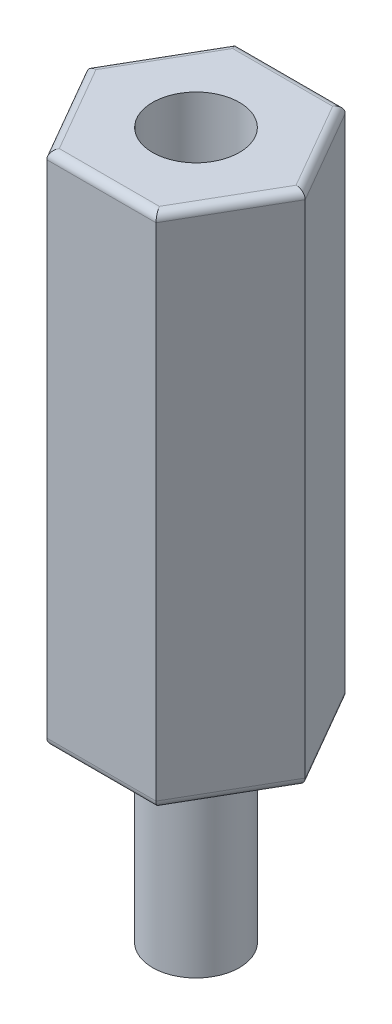
ISO-10303-21;
HEADER;
FILE_DESCRIPTION(('STEP AP214'),'2;1');
FILE_NAME('part.step','',(''),(''),'','','');
FILE_SCHEMA(('AUTOMOTIVE_DESIGN { 1 0 10303 214 1 1 1 1 }'));
ENDSEC;
DATA;
#1=APPLICATION_CONTEXT('core data for automotive mechanical design processes');
#2=APPLICATION_PROTOCOL_DEFINITION('international standard','automotive_design',2000,#1);
#3=PRODUCT_CONTEXT('',#1,'mechanical');
#4=PRODUCT('Part','Part','',(#3));
#5=PRODUCT_RELATED_PRODUCT_CATEGORY('part','',(#4));
#6=PRODUCT_DEFINITION_FORMATION('','',#4);
#7=PRODUCT_DEFINITION_CONTEXT('part definition',#1,'design');
#8=PRODUCT_DEFINITION('design','',#6,#7);
#9=PRODUCT_DEFINITION_SHAPE('','',#8);
#10=(LENGTH_UNIT() NAMED_UNIT(*) SI_UNIT(.MILLI.,.METRE.));
#11=(NAMED_UNIT(*) PLANE_ANGLE_UNIT() SI_UNIT($,.RADIAN.));
#12=(NAMED_UNIT(*) SI_UNIT($,.STERADIAN.) SOLID_ANGLE_UNIT());
#13=UNCERTAINTY_MEASURE_WITH_UNIT(LENGTH_MEASURE(1.E-05),#10,'distance_accuracy_value','');
#14=(GEOMETRIC_REPRESENTATION_CONTEXT(3) GLOBAL_UNCERTAINTY_ASSIGNED_CONTEXT((#13)) GLOBAL_UNIT_ASSIGNED_CONTEXT((#10,
#11,#12)) REPRESENTATION_CONTEXT('',''));
#15=CARTESIAN_POINT('',(0.,0.,0.));
#16=DIRECTION('',(0.,0.,1.));
#17=DIRECTION('',(1.,0.,0.));
#18=AXIS2_PLACEMENT_3D('',#15,#16,#17);
#19=CARTESIAN_POINT('',(2.74818728134262,0.,0.));
#20=DIRECTION('',(0.,1.,0.));
#21=DIRECTION('',(0.,0.,1.));
#22=AXIS2_PLACEMENT_3D('',#19,#20,#21);
#23=PLANE('',#22);
#24=DIRECTION('',(0.5,0.,-0.866025403784439));
#25=VECTOR('',#24,1.);
#26=CARTESIAN_POINT('',(2.57498220058573,0.,-0.1));
#27=LINE('',#26,#25);
#28=CARTESIAN_POINT('',(2.51724717366677,0.,0.));
#29=VERTEX_POINT('',#28);
#30=CARTESIAN_POINT('',(1.25862358683338,0.,2.18));
#31=VERTEX_POINT('',#30);
#32=EDGE_CURVE('E188',#29,#31,#27,.F.);
#33=ORIENTED_EDGE('',*,*,#32,.T.);
#34=DIRECTION('',(1.,0.,0.));
#35=VECTOR('',#34,1.);
#36=CARTESIAN_POINT('',(2.74818728134262,0.,2.18));
#37=LINE('',#36,#35);
#38=CARTESIAN_POINT('',(-1.25862358683338,0.,2.18));
#39=VERTEX_POINT('',#38);
#40=EDGE_CURVE('E41',#31,#39,#37,.F.);
#41=ORIENTED_EDGE('',*,*,#40,.T.);
#42=DIRECTION('',(0.5,0.,0.866025403784439));
#43=VECTOR('',#42,1.);
#44=CARTESIAN_POINT('',(-1.20088855991442,0.,2.28));
#45=LINE('',#44,#43);
#46=CARTESIAN_POINT('',(-2.51724717366677,0.,0.));
#47=VERTEX_POINT('',#46);
#48=EDGE_CURVE('E55',#39,#47,#45,.F.);
#49=ORIENTED_EDGE('',*,*,#48,.T.);
#50=DIRECTION('',(-0.5,0.,0.866025403784439));
#51=VECTOR('',#50,1.);
#52=CARTESIAN_POINT('',(-1.20088855991442,0.,-2.28));
#53=LINE('',#52,#51);
#54=CARTESIAN_POINT('',(-1.25862358683338,0.,-2.18));
#55=VERTEX_POINT('',#54);
#56=EDGE_CURVE('E194',#47,#55,#53,.F.);
#57=ORIENTED_EDGE('',*,*,#56,.T.);
#58=DIRECTION('',(-1.,0.,0.));
#59=VECTOR('',#58,1.);
#60=CARTESIAN_POINT('',(2.74818728134262,0.,-2.18));
#61=LINE('',#60,#59);
#62=CARTESIAN_POINT('',(1.25862358683338,0.,-2.18));
#63=VERTEX_POINT('',#62);
#64=EDGE_CURVE('E192',#55,#63,#61,.F.);
#65=ORIENTED_EDGE('',*,*,#64,.T.);
#66=DIRECTION('',(-0.5,0.,-0.866025403784439));
#67=VECTOR('',#66,1.);
#68=CARTESIAN_POINT('',(2.57498220058573,0.,0.1));
#69=LINE('',#68,#67);
#70=EDGE_CURVE('E190',#63,#29,#69,.F.);
#71=ORIENTED_EDGE('',*,*,#70,.T.);
#72=EDGE_LOOP('',(#33,#41,#49,#57,#65,#71));
#73=FACE_BOUND('',#72,.T.);
#74=CARTESIAN_POINT('',(0.,0.,0.));
#75=DIRECTION('',(0.,1.,0.));
#76=DIRECTION('',(0.,0.,1.));
#77=AXIS2_PLACEMENT_3D('',#74,#75,#76);
#78=CIRCLE('',#77,1.0922);
#79=CARTESIAN_POINT('',(0.,0.,1.0922));
#80=VERTEX_POINT('',#79);
#81=EDGE_CURVE('E11',#80,#80,#78,.F.);
#82=ORIENTED_EDGE('',*,*,#81,.F.);
#83=EDGE_LOOP('',(#82));
#84=FACE_BOUND('',#83,.T.);
#85=ADVANCED_FACE('F33',(#73,#84),#23,.F.);
#86=CARTESIAN_POINT('',(1.37409364067131,13.,2.38));
#87=DIRECTION('',(-0.866025403784439,0.,-0.5));
#88=DIRECTION('',(-0.5,0.,0.866025403784439));
#89=AXIS2_PLACEMENT_3D('',#86,#87,#88);
#90=PLANE('',#89);
#91=DIRECTION('',(0.,-1.,0.));
#92=VECTOR('',#91,1.);
#93=CARTESIAN_POINT('',(2.74818728134262,13.,0.));
#94=LINE('',#93,#92);
#95=CARTESIAN_POINT('',(2.74818728134262,12.8,0.));
#96=VERTEX_POINT('',#95);
#97=CARTESIAN_POINT('',(2.74818728134262,0.200000000000002,0.));
#98=VERTEX_POINT('',#97);
#99=EDGE_CURVE('E149',#96,#98,#94,.T.);
#100=ORIENTED_EDGE('',*,*,#99,.F.);
#101=DIRECTION('',(0.5,0.,-0.866025403784439));
#102=VECTOR('',#101,1.);
#103=CARTESIAN_POINT('',(1.37409364067131,12.8,2.38));
#104=LINE('',#103,#102);
#105=CARTESIAN_POINT('',(1.37409364067131,12.8,2.38));
#106=VERTEX_POINT('',#105);
#107=EDGE_CURVE('E140',#96,#106,#104,.F.);
#108=ORIENTED_EDGE('',*,*,#107,.T.);
#109=DIRECTION('',(0.,-1.,0.));
#110=VECTOR('',#109,1.);
#111=CARTESIAN_POINT('',(1.37409364067131,13.,2.38));
#112=LINE('',#111,#110);
#113=CARTESIAN_POINT('',(1.37409364067131,0.200000000000004,2.38));
#114=VERTEX_POINT('',#113);
#115=EDGE_CURVE('E208',#106,#114,#112,.T.);
#116=ORIENTED_EDGE('',*,*,#115,.T.);
#117=DIRECTION('',(0.5,0.,-0.866025403784439));
#118=VECTOR('',#117,1.);
#119=CARTESIAN_POINT('',(1.37409364067131,0.200000000000001,2.38));
#120=LINE('',#119,#118);
#121=EDGE_CURVE('E181',#114,#98,#120,.T.);
#122=ORIENTED_EDGE('',*,*,#121,.T.);
#123=EDGE_LOOP('',(#100,#108,#116,#122));
#124=FACE_BOUND('',#123,.T.);
#125=ADVANCED_FACE('F253',(#124),#90,.F.);
#126=CARTESIAN_POINT('',(2.74818728134262,13.,0.));
#127=DIRECTION('',(-0.866025403784438,0.,0.5));
#128=DIRECTION('',(0.5,0.,0.866025403784439));
#129=AXIS2_PLACEMENT_3D('',#126,#127,#128);
#130=PLANE('',#129);
#131=DIRECTION('',(0.,-1.,0.));
#132=VECTOR('',#131,1.);
#133=CARTESIAN_POINT('',(1.37409364067131,13.,-2.38));
#134=LINE('',#133,#132);
#135=CARTESIAN_POINT('',(1.37409364067131,12.8,-2.38));
#136=VERTEX_POINT('',#135);
#137=CARTESIAN_POINT('',(1.37409364067131,0.200000000000002,-2.38));
#138=VERTEX_POINT('',#137);
#139=EDGE_CURVE('E152',#136,#138,#134,.T.);
#140=ORIENTED_EDGE('',*,*,#139,.F.);
#141=DIRECTION('',(-0.5,0.,-0.866025403784439));
#142=VECTOR('',#141,1.);
#143=CARTESIAN_POINT('',(2.74818728134262,12.8,0.));
#144=LINE('',#143,#142);
#145=EDGE_CURVE('E186',#136,#96,#144,.F.);
#146=ORIENTED_EDGE('',*,*,#145,.T.);
#147=ORIENTED_EDGE('',*,*,#99,.T.);
#148=DIRECTION('',(-0.5,0.,-0.866025403784439));
#149=VECTOR('',#148,1.);
#150=CARTESIAN_POINT('',(2.74818728134262,0.200000000000001,0.));
#151=LINE('',#150,#149);
#152=EDGE_CURVE('E184',#98,#138,#151,.T.);
#153=ORIENTED_EDGE('',*,*,#152,.T.);
#154=EDGE_LOOP('',(#140,#146,#147,#153));
#155=FACE_BOUND('',#154,.T.);
#156=ADVANCED_FACE('F271',(#155),#130,.F.);
#157=CARTESIAN_POINT('',(1.37409364067131,13.,-2.38));
#158=DIRECTION('',(0.,0.,1.));
#159=DIRECTION('',(1.,0.,0.));
#160=AXIS2_PLACEMENT_3D('',#157,#158,#159);
#161=PLANE('',#160);
#162=DIRECTION('',(0.,-1.,0.));
#163=VECTOR('',#162,1.);
#164=CARTESIAN_POINT('',(-1.37409364067131,13.,-2.38));
#165=LINE('',#164,#163);
#166=CARTESIAN_POINT('',(-1.37409364067131,12.8,-2.38));
#167=VERTEX_POINT('',#166);
#168=CARTESIAN_POINT('',(-1.37409364067131,0.200000000000002,-2.38));
#169=VERTEX_POINT('',#168);
#170=EDGE_CURVE('E262',#167,#169,#165,.T.);
#171=ORIENTED_EDGE('',*,*,#170,.F.);
#172=DIRECTION('',(-1.,0.,0.));
#173=VECTOR('',#172,1.);
#174=CARTESIAN_POINT('',(1.37409364067131,12.8,-2.38));
#175=LINE('',#174,#173);
#176=EDGE_CURVE('E165',#167,#136,#175,.F.);
#177=ORIENTED_EDGE('',*,*,#176,.T.);
#178=ORIENTED_EDGE('',*,*,#139,.T.);
#179=DIRECTION('',(-1.,0.,0.));
#180=VECTOR('',#179,1.);
#181=CARTESIAN_POINT('',(1.37409364067131,0.200000000000001,-2.38));
#182=LINE('',#181,#180);
#183=EDGE_CURVE('E163',#138,#169,#182,.T.);
#184=ORIENTED_EDGE('',*,*,#183,.T.);
#185=EDGE_LOOP('',(#171,#177,#178,#184));
#186=FACE_BOUND('',#185,.T.);
#187=ADVANCED_FACE('F268',(#186),#161,.F.);
#188=CARTESIAN_POINT('',(-1.37409364067131,13.,-2.38));
#189=DIRECTION('',(0.866025403784439,0.,0.5));
#190=DIRECTION('',(0.5,0.,-0.866025403784439));
#191=AXIS2_PLACEMENT_3D('',#188,#189,#190);
#192=PLANE('',#191);
#193=DIRECTION('',(0.,-1.,0.));
#194=VECTOR('',#193,1.);
#195=CARTESIAN_POINT('',(-2.74818728134262,13.,0.));
#196=LINE('',#195,#194);
#197=CARTESIAN_POINT('',(-2.74818728134262,12.8,0.));
#198=VERTEX_POINT('',#197);
#199=CARTESIAN_POINT('',(-2.74818728134262,0.200000000000002,0.));
#200=VERTEX_POINT('',#199);
#201=EDGE_CURVE('E255',#198,#200,#196,.T.);
#202=ORIENTED_EDGE('',*,*,#201,.F.);
#203=DIRECTION('',(-0.5,0.,0.866025403784439));
#204=VECTOR('',#203,1.);
#205=CARTESIAN_POINT('',(-1.37409364067131,12.8,-2.38));
#206=LINE('',#205,#204);
#207=EDGE_CURVE('E170',#198,#167,#206,.F.);
#208=ORIENTED_EDGE('',*,*,#207,.T.);
#209=ORIENTED_EDGE('',*,*,#170,.T.);
#210=DIRECTION('',(-0.5,0.,0.866025403784439));
#211=VECTOR('',#210,1.);
#212=CARTESIAN_POINT('',(-1.37409364067131,0.200000000000001,-2.38));
#213=LINE('',#212,#211);
#214=EDGE_CURVE('E168',#169,#200,#213,.T.);
#215=ORIENTED_EDGE('',*,*,#214,.T.);
#216=EDGE_LOOP('',(#202,#208,#209,#215));
#217=FACE_BOUND('',#216,.T.);
#218=ADVANCED_FACE('F278',(#217),#192,.F.);
#219=CARTESIAN_POINT('',(-2.74818728134262,13.,0.));
#220=DIRECTION('',(0.866025403784438,0.,-0.5));
#221=DIRECTION('',(-0.5,0.,-0.866025403784439));
#222=AXIS2_PLACEMENT_3D('',#219,#220,#221);
#223=PLANE('',#222);
#224=DIRECTION('',(0.,-1.,0.));
#225=VECTOR('',#224,1.);
#226=CARTESIAN_POINT('',(-1.37409364067131,13.,2.38));
#227=LINE('',#226,#225);
#228=CARTESIAN_POINT('',(-1.37409364067131,12.8,2.38));
#229=VERTEX_POINT('',#228);
#230=CARTESIAN_POINT('',(-1.37409364067131,0.200000000000002,2.38));
#231=VERTEX_POINT('',#230);
#232=EDGE_CURVE('E250',#229,#231,#227,.T.);
#233=ORIENTED_EDGE('',*,*,#232,.F.);
#234=DIRECTION('',(0.5,0.,0.866025403784439));
#235=VECTOR('',#234,1.);
#236=CARTESIAN_POINT('',(-2.74818728134262,12.8,0.));
#237=LINE('',#236,#235);
#238=EDGE_CURVE('E174',#229,#198,#237,.F.);
#239=ORIENTED_EDGE('',*,*,#238,.T.);
#240=ORIENTED_EDGE('',*,*,#201,.T.);
#241=DIRECTION('',(0.5,0.,0.866025403784439));
#242=VECTOR('',#241,1.);
#243=CARTESIAN_POINT('',(-2.74818728134262,0.200000000000001,0.));
#244=LINE('',#243,#242);
#245=EDGE_CURVE('E172',#200,#231,#244,.T.);
#246=ORIENTED_EDGE('',*,*,#245,.T.);
#247=EDGE_LOOP('',(#233,#239,#240,#246));
#248=FACE_BOUND('',#247,.T.);
#249=ADVANCED_FACE('F290',(#248),#223,.F.);
#250=CARTESIAN_POINT('',(-1.37409364067131,13.,2.38));
#251=DIRECTION('',(0.,0.,-1.));
#252=DIRECTION('',(-1.,0.,0.));
#253=AXIS2_PLACEMENT_3D('',#250,#251,#252);
#254=PLANE('',#253);
#255=ORIENTED_EDGE('',*,*,#115,.F.);
#256=DIRECTION('',(1.,0.,0.));
#257=VECTOR('',#256,1.);
#258=CARTESIAN_POINT('',(-1.37409364067131,12.8,2.38));
#259=LINE('',#258,#257);
#260=EDGE_CURVE('E179',#106,#229,#259,.F.);
#261=ORIENTED_EDGE('',*,*,#260,.T.);
#262=ORIENTED_EDGE('',*,*,#232,.T.);
#263=DIRECTION('',(1.,0.,0.));
#264=VECTOR('',#263,1.);
#265=CARTESIAN_POINT('',(-1.37409364067131,0.200000000000001,2.38));
#266=LINE('',#265,#264);
#267=EDGE_CURVE('E176',#231,#114,#266,.T.);
#268=ORIENTED_EDGE('',*,*,#267,.T.);
#269=EDGE_LOOP('',(#255,#261,#262,#268));
#270=FACE_BOUND('',#269,.T.);
#271=ADVANCED_FACE('F247',(#270),#254,.F.);
#272=CARTESIAN_POINT('',(2.74818728134262,13.,0.));
#273=DIRECTION('',(0.,1.,0.));
#274=DIRECTION('',(0.,0.,1.));
#275=AXIS2_PLACEMENT_3D('',#272,#273,#274);
#276=PLANE('',#275);
#277=CARTESIAN_POINT('',(0.,13.,0.));
#278=DIRECTION('',(0.,1.,0.));
#279=DIRECTION('',(0.,0.,1.));
#280=AXIS2_PLACEMENT_3D('',#277,#278,#279);
#281=CIRCLE('',#280,1.0922);
#282=CARTESIAN_POINT('',(0.,13.,1.0922));
#283=VERTEX_POINT('',#282);
#284=EDGE_CURVE('E373',#283,#283,#281,.T.);
#285=ORIENTED_EDGE('',*,*,#284,.F.);
#286=EDGE_LOOP('',(#285));
#287=FACE_BOUND('',#286,.T.);
#288=DIRECTION('',(-0.5,0.,-0.866025403784439));
#289=VECTOR('',#288,1.);
#290=CARTESIAN_POINT('',(1.20088855991442,13.,-2.28));
#291=LINE('',#290,#289);
#292=CARTESIAN_POINT('',(2.51724717366677,13.,0.));
#293=VERTEX_POINT('',#292);
#294=CARTESIAN_POINT('',(1.25862358683338,13.,-2.18));
#295=VERTEX_POINT('',#294);
#296=EDGE_CURVE('E128',#293,#295,#291,.T.);
#297=ORIENTED_EDGE('',*,*,#296,.T.);
#298=DIRECTION('',(-1.,0.,0.));
#299=VECTOR('',#298,1.);
#300=CARTESIAN_POINT('',(-1.37409364067131,13.,-2.18));
#301=LINE('',#300,#299);
#302=CARTESIAN_POINT('',(-1.25862358683338,13.,-2.18));
#303=VERTEX_POINT('',#302);
#304=EDGE_CURVE('E161',#295,#303,#301,.T.);
#305=ORIENTED_EDGE('',*,*,#304,.T.);
#306=DIRECTION('',(-0.5,0.,0.866025403784439));
#307=VECTOR('',#306,1.);
#308=CARTESIAN_POINT('',(-2.57498220058573,13.,0.100000000000002));
#309=LINE('',#308,#307);
#310=CARTESIAN_POINT('',(-2.51724717366677,13.,0.));
#311=VERTEX_POINT('',#310);
#312=EDGE_CURVE('E159',#303,#311,#309,.T.);
#313=ORIENTED_EDGE('',*,*,#312,.T.);
#314=DIRECTION('',(0.5,0.,0.866025403784439));
#315=VECTOR('',#314,1.);
#316=CARTESIAN_POINT('',(-1.20088855991442,13.,2.28));
#317=LINE('',#316,#315);
#318=CARTESIAN_POINT('',(-1.25862358683339,13.,2.18));
#319=VERTEX_POINT('',#318);
#320=EDGE_CURVE('E157',#311,#319,#317,.T.);
#321=ORIENTED_EDGE('',*,*,#320,.T.);
#322=DIRECTION('',(1.,0.,0.));
#323=VECTOR('',#322,1.);
#324=CARTESIAN_POINT('',(1.37409364067131,13.,2.18));
#325=LINE('',#324,#323);
#326=CARTESIAN_POINT('',(1.25862358683338,13.,2.18));
#327=VERTEX_POINT('',#326);
#328=EDGE_CURVE('E131',#319,#327,#325,.T.);
#329=ORIENTED_EDGE('',*,*,#328,.T.);
#330=DIRECTION('',(0.5,0.,-0.866025403784439));
#331=VECTOR('',#330,1.);
#332=CARTESIAN_POINT('',(2.57498220058573,13.,-0.1));
#333=LINE('',#332,#331);
#334=EDGE_CURVE('E123',#327,#293,#333,.T.);
#335=ORIENTED_EDGE('',*,*,#334,.T.);
#336=EDGE_LOOP('',(#297,#305,#313,#321,#329,#335));
#337=FACE_BOUND('',#336,.T.);
#338=ADVANCED_FACE('F125',(#287,#337),#276,.T.);
#339=CARTESIAN_POINT('',(2.74818728134262,12.8,2.18));
#340=DIRECTION('',(-1.,0.,0.));
#341=DIRECTION('',(0.,0.,1.));
#342=AXIS2_PLACEMENT_3D('',#339,#340,#341);
#343=CYLINDRICAL_SURFACE('',#342,0.2);
#344=CARTESIAN_POINT('',(-1.25862358683338,12.8,2.18));
#345=DIRECTION('',(-0.866025403784439,0.,-0.5));
#346=DIRECTION('',(-0.5,0.,0.866025403784439));
#347=AXIS2_PLACEMENT_3D('',#344,#345,#346);
#348=ELLIPSE('',#347,0.23094010767585,0.2);
#349=EDGE_CURVE('E143',#229,#319,#348,.T.);
#350=ORIENTED_EDGE('',*,*,#349,.F.);
#351=ORIENTED_EDGE('',*,*,#260,.F.);
#352=CARTESIAN_POINT('',(1.25862358683338,12.8,2.18));
#353=DIRECTION('',(-0.866025403784438,0.,0.5));
#354=DIRECTION('',(0.5,0.,0.866025403784439));
#355=AXIS2_PLACEMENT_3D('',#352,#353,#354);
#356=ELLIPSE('',#355,0.23094010767585,0.2);
#357=EDGE_CURVE('E206',#327,#106,#356,.F.);
#358=ORIENTED_EDGE('',*,*,#357,.F.);
#359=ORIENTED_EDGE('',*,*,#328,.F.);
#360=EDGE_LOOP('',(#350,#351,#358,#359));
#361=FACE_BOUND('',#360,.T.);
#362=ADVANCED_FACE('F313',(#361),#343,.T.);
#363=CARTESIAN_POINT('',(2.57498220058573,12.8,-0.1));
#364=DIRECTION('',(-0.5,0.,0.866025403784439));
#365=DIRECTION('',(0.866025403784439,0.,0.5));
#366=AXIS2_PLACEMENT_3D('',#363,#364,#365);
#367=CYLINDRICAL_SURFACE('',#366,0.2);
#368=ORIENTED_EDGE('',*,*,#357,.T.);
#369=ORIENTED_EDGE('',*,*,#107,.F.);
#370=CARTESIAN_POINT('',(2.51724717366677,12.8,0.));
#371=DIRECTION('',(0.,0.,1.));
#372=DIRECTION('',(1.,0.,0.));
#373=AXIS2_PLACEMENT_3D('',#370,#371,#372);
#374=ELLIPSE('',#373,0.23094010767585,0.2);
#375=EDGE_CURVE('E138',#293,#96,#374,.F.);
#376=ORIENTED_EDGE('',*,*,#375,.F.);
#377=ORIENTED_EDGE('',*,*,#334,.F.);
#378=EDGE_LOOP('',(#368,#369,#376,#377));
#379=FACE_BOUND('',#378,.T.);
#380=ADVANCED_FACE('F139',(#379),#367,.T.);
#381=CARTESIAN_POINT('',(-1.20088855991442,12.8,2.28));
#382=DIRECTION('',(-0.5,0.,-0.866025403784439));
#383=DIRECTION('',(-0.866025403784438,0.,0.5));
#384=AXIS2_PLACEMENT_3D('',#381,#382,#383);
#385=CYLINDRICAL_SURFACE('',#384,0.2);
#386=ORIENTED_EDGE('',*,*,#349,.T.);
#387=ORIENTED_EDGE('',*,*,#320,.F.);
#388=CARTESIAN_POINT('',(-2.51724717366677,12.8,0.));
#389=DIRECTION('',(0.,0.,-1.));
#390=DIRECTION('',(-1.,0.,0.));
#391=AXIS2_PLACEMENT_3D('',#388,#389,#390);
#392=ELLIPSE('',#391,0.23094010767585,0.2);
#393=EDGE_CURVE('E144',#198,#311,#392,.T.);
#394=ORIENTED_EDGE('',*,*,#393,.F.);
#395=ORIENTED_EDGE('',*,*,#238,.F.);
#396=EDGE_LOOP('',(#386,#387,#394,#395));
#397=FACE_BOUND('',#396,.T.);
#398=ADVANCED_FACE('F304',(#397),#385,.T.);
#399=CARTESIAN_POINT('',(2.57498220058573,12.8,0.1));
#400=DIRECTION('',(0.5,0.,0.866025403784439));
#401=DIRECTION('',(0.866025403784438,0.,-0.5));
#402=AXIS2_PLACEMENT_3D('',#399,#400,#401);
#403=CYLINDRICAL_SURFACE('',#402,0.2);
#404=ORIENTED_EDGE('',*,*,#375,.T.);
#405=ORIENTED_EDGE('',*,*,#145,.F.);
#406=CARTESIAN_POINT('',(1.25862358683338,12.8,-2.18));
#407=DIRECTION('',(0.866025403784439,0.,0.5));
#408=DIRECTION('',(-0.5,0.,0.866025403784439));
#409=AXIS2_PLACEMENT_3D('',#406,#407,#408);
#410=ELLIPSE('',#409,0.23094010767585,0.2);
#411=EDGE_CURVE('E147',#295,#136,#410,.F.);
#412=ORIENTED_EDGE('',*,*,#411,.F.);
#413=ORIENTED_EDGE('',*,*,#296,.F.);
#414=EDGE_LOOP('',(#404,#405,#412,#413));
#415=FACE_BOUND('',#414,.T.);
#416=ADVANCED_FACE('F146',(#415),#403,.T.);
#417=CARTESIAN_POINT('',(-1.20088855991442,12.8,-2.28));
#418=DIRECTION('',(0.5,0.,-0.866025403784439));
#419=DIRECTION('',(-0.866025403784439,0.,-0.5));
#420=AXIS2_PLACEMENT_3D('',#417,#418,#419);
#421=CYLINDRICAL_SURFACE('',#420,0.2);
#422=ORIENTED_EDGE('',*,*,#393,.T.);
#423=ORIENTED_EDGE('',*,*,#312,.F.);
#424=CARTESIAN_POINT('',(-1.25862358683338,12.8,-2.18));
#425=DIRECTION('',(0.866025403784439,0.,-0.5));
#426=DIRECTION('',(-0.5,0.,-0.866025403784439));
#427=AXIS2_PLACEMENT_3D('',#424,#425,#426);
#428=ELLIPSE('',#427,0.23094010767585,0.2);
#429=EDGE_CURVE('E198',#167,#303,#428,.T.);
#430=ORIENTED_EDGE('',*,*,#429,.F.);
#431=ORIENTED_EDGE('',*,*,#207,.F.);
#432=EDGE_LOOP('',(#422,#423,#430,#431));
#433=FACE_BOUND('',#432,.T.);
#434=ADVANCED_FACE('F308',(#433),#421,.T.);
#435=CARTESIAN_POINT('',(2.74818728134262,12.8,-2.18));
#436=DIRECTION('',(1.,0.,0.));
#437=DIRECTION('',(0.,0.,-1.));
#438=AXIS2_PLACEMENT_3D('',#435,#436,#437);
#439=CYLINDRICAL_SURFACE('',#438,0.2);
#440=ORIENTED_EDGE('',*,*,#411,.T.);
#441=ORIENTED_EDGE('',*,*,#176,.F.);
#442=ORIENTED_EDGE('',*,*,#429,.T.);
#443=ORIENTED_EDGE('',*,*,#304,.F.);
#444=EDGE_LOOP('',(#440,#441,#442,#443));
#445=FACE_BOUND('',#444,.T.);
#446=ADVANCED_FACE('F310',(#445),#439,.T.);
#447=CARTESIAN_POINT('',(1.37409364067131,0.200000000000001,-2.18));
#448=DIRECTION('',(-1.,0.,0.));
#449=DIRECTION('',(0.,0.,1.));
#450=AXIS2_PLACEMENT_3D('',#447,#448,#449);
#451=CYLINDRICAL_SURFACE('',#450,0.2);
#452=CARTESIAN_POINT('',(1.25862358683338,0.200000000000001,-2.18));
#453=DIRECTION('',(-0.866025403784439,0.,-0.5));
#454=DIRECTION('',(0.5,0.,-0.866025403784439));
#455=AXIS2_PLACEMENT_3D('',#452,#453,#454);
#456=ELLIPSE('',#455,0.23094010767585,0.2);
#457=EDGE_CURVE('E219',#63,#138,#456,.F.);
#458=ORIENTED_EDGE('',*,*,#457,.F.);
#459=ORIENTED_EDGE('',*,*,#64,.F.);
#460=CARTESIAN_POINT('',(-1.25862358683338,0.200000000000001,-2.18));
#461=DIRECTION('',(-0.866025403784439,0.,0.5));
#462=DIRECTION('',(-0.5,0.,-0.866025403784439));
#463=AXIS2_PLACEMENT_3D('',#460,#461,#462);
#464=ELLIPSE('',#463,0.23094010767585,0.2);
#465=EDGE_CURVE('E200',#169,#55,#464,.T.);
#466=ORIENTED_EDGE('',*,*,#465,.F.);
#467=ORIENTED_EDGE('',*,*,#183,.F.);
#468=EDGE_LOOP('',(#458,#459,#466,#467));
#469=FACE_BOUND('',#468,.T.);
#470=ADVANCED_FACE('F35',(#469),#451,.T.);
#471=CARTESIAN_POINT('',(-1.20088855991442,0.200000000000001,-2.28));
#472=DIRECTION('',(-0.5,0.,0.866025403784439));
#473=DIRECTION('',(0.866025403784439,0.,0.5));
#474=AXIS2_PLACEMENT_3D('',#471,#472,#473);
#475=CYLINDRICAL_SURFACE('',#474,0.2);
#476=ORIENTED_EDGE('',*,*,#465,.T.);
#477=ORIENTED_EDGE('',*,*,#56,.F.);
#478=CARTESIAN_POINT('',(-2.51724717366677,0.200000000000001,0.));
#479=DIRECTION('',(0.,0.,1.));
#480=DIRECTION('',(-1.,0.,0.));
#481=AXIS2_PLACEMENT_3D('',#478,#479,#480);
#482=ELLIPSE('',#481,0.23094010767585,0.2);
#483=EDGE_CURVE('E216',#200,#47,#482,.T.);
#484=ORIENTED_EDGE('',*,*,#483,.F.);
#485=ORIENTED_EDGE('',*,*,#214,.F.);
#486=EDGE_LOOP('',(#476,#477,#484,#485));
#487=FACE_BOUND('',#486,.T.);
#488=ADVANCED_FACE('F225',(#487),#475,.T.);
#489=CARTESIAN_POINT('',(2.57498220058573,0.200000000000001,0.1));
#490=DIRECTION('',(-0.5,0.,-0.866025403784439));
#491=DIRECTION('',(-0.866025403784438,0.,0.5));
#492=AXIS2_PLACEMENT_3D('',#489,#490,#491);
#493=CYLINDRICAL_SURFACE('',#492,0.2);
#494=ORIENTED_EDGE('',*,*,#457,.T.);
#495=ORIENTED_EDGE('',*,*,#152,.F.);
#496=CARTESIAN_POINT('',(2.51724717366677,0.200000000000001,0.));
#497=DIRECTION('',(0.,0.,-1.));
#498=DIRECTION('',(1.,0.,0.));
#499=AXIS2_PLACEMENT_3D('',#496,#497,#498);
#500=ELLIPSE('',#499,0.23094010767585,0.2);
#501=EDGE_CURVE('E213',#29,#98,#500,.F.);
#502=ORIENTED_EDGE('',*,*,#501,.F.);
#503=ORIENTED_EDGE('',*,*,#70,.F.);
#504=EDGE_LOOP('',(#494,#495,#502,#503));
#505=FACE_BOUND('',#504,.T.);
#506=ADVANCED_FACE('F237',(#505),#493,.T.);
#507=CARTESIAN_POINT('',(-2.57498220058573,0.200000000000001,-0.0999999999999992));
#508=DIRECTION('',(0.5,0.,0.866025403784439));
#509=DIRECTION('',(0.866025403784438,0.,-0.5));
#510=AXIS2_PLACEMENT_3D('',#507,#508,#509);
#511=CYLINDRICAL_SURFACE('',#510,0.2);
#512=ORIENTED_EDGE('',*,*,#483,.T.);
#513=ORIENTED_EDGE('',*,*,#48,.F.);
#514=CARTESIAN_POINT('',(-1.25862358683338,0.200000000000001,2.18));
#515=DIRECTION('',(0.866025403784439,0.,0.5));
#516=DIRECTION('',(-0.5,0.,0.866025403784439));
#517=AXIS2_PLACEMENT_3D('',#514,#515,#516);
#518=ELLIPSE('',#517,0.23094010767585,0.2);
#519=EDGE_CURVE('E48',#231,#39,#518,.T.);
#520=ORIENTED_EDGE('',*,*,#519,.F.);
#521=ORIENTED_EDGE('',*,*,#245,.F.);
#522=EDGE_LOOP('',(#512,#513,#520,#521));
#523=FACE_BOUND('',#522,.T.);
#524=ADVANCED_FACE('F316',(#523),#511,.T.);
#525=CARTESIAN_POINT('',(1.20088855991442,0.200000000000001,2.28));
#526=DIRECTION('',(0.5,0.,-0.866025403784439));
#527=DIRECTION('',(-0.866025403784439,0.,-0.5));
#528=AXIS2_PLACEMENT_3D('',#525,#526,#527);
#529=CYLINDRICAL_SURFACE('',#528,0.2);
#530=ORIENTED_EDGE('',*,*,#501,.T.);
#531=ORIENTED_EDGE('',*,*,#121,.F.);
#532=CARTESIAN_POINT('',(1.25862358683338,0.200000000000001,2.18));
#533=DIRECTION('',(0.866025403784438,0.,-0.5));
#534=DIRECTION('',(-0.5,0.,-0.866025403784439));
#535=AXIS2_PLACEMENT_3D('',#532,#533,#534);
#536=ELLIPSE('',#535,0.23094010767585,0.2);
#537=EDGE_CURVE('E209',#31,#114,#536,.F.);
#538=ORIENTED_EDGE('',*,*,#537,.F.);
#539=ORIENTED_EDGE('',*,*,#32,.F.);
#540=EDGE_LOOP('',(#530,#531,#538,#539));
#541=FACE_BOUND('',#540,.T.);
#542=ADVANCED_FACE('F241',(#541),#529,.T.);
#543=CARTESIAN_POINT('',(-1.37409364067131,0.200000000000001,2.18));
#544=DIRECTION('',(1.,0.,0.));
#545=DIRECTION('',(0.,0.,-1.));
#546=AXIS2_PLACEMENT_3D('',#543,#544,#545);
#547=CYLINDRICAL_SURFACE('',#546,0.2);
#548=ORIENTED_EDGE('',*,*,#519,.T.);
#549=ORIENTED_EDGE('',*,*,#40,.F.);
#550=ORIENTED_EDGE('',*,*,#537,.T.);
#551=ORIENTED_EDGE('',*,*,#267,.F.);
#552=EDGE_LOOP('',(#548,#549,#550,#551));
#553=FACE_BOUND('',#552,.T.);
#554=ADVANCED_FACE('F242',(#553),#547,.T.);
#555=CARTESIAN_POINT('',(0.,-4.76,0.));
#556=DIRECTION('',(0.,1.,0.));
#557=DIRECTION('',(0.,0.,1.));
#558=AXIS2_PLACEMENT_3D('',#555,#556,#557);
#559=CYLINDRICAL_SURFACE('',#558,1.0922);
#560=CARTESIAN_POINT('',(0.,-4.76,0.));
#561=DIRECTION('',(0.,-1.,0.));
#562=DIRECTION('',(0.,0.,-1.));
#563=AXIS2_PLACEMENT_3D('',#560,#561,#562);
#564=CIRCLE('',#563,1.0922);
#565=CARTESIAN_POINT('',(0.,-4.76,-1.0922));
#566=VERTEX_POINT('',#565);
#567=EDGE_CURVE('E211',#566,#566,#564,.T.);
#568=ORIENTED_EDGE('',*,*,#567,.F.);
#569=EDGE_LOOP('',(#568));
#570=FACE_BOUND('',#569,.T.);
#571=ORIENTED_EDGE('',*,*,#81,.T.);
#572=EDGE_LOOP('',(#571));
#573=FACE_BOUND('',#572,.T.);
#574=ADVANCED_FACE('F347',(#570,#573),#559,.T.);
#575=CARTESIAN_POINT('',(0.,-4.76,0.));
#576=DIRECTION('',(0.,-1.,0.));
#577=DIRECTION('',(0.,0.,-1.));
#578=AXIS2_PLACEMENT_3D('',#575,#576,#577);
#579=PLANE('',#578);
#580=ORIENTED_EDGE('',*,*,#567,.T.);
#581=EDGE_LOOP('',(#580));
#582=FACE_BOUND('',#581,.T.);
#583=ADVANCED_FACE('F351',(#582),#579,.T.);
#584=CARTESIAN_POINT('',(0.,8.24,0.));
#585=DIRECTION('',(0.,1.,0.));
#586=DIRECTION('',(0.,0.,1.));
#587=AXIS2_PLACEMENT_3D('',#584,#585,#586);
#588=CYLINDRICAL_SURFACE('',#587,1.0922);
#589=CARTESIAN_POINT('',(0.,8.24,0.));
#590=DIRECTION('',(0.,1.,0.));
#591=DIRECTION('',(0.,0.,1.));
#592=AXIS2_PLACEMENT_3D('',#589,#590,#591);
#593=CIRCLE('',#592,1.0922);
#594=CARTESIAN_POINT('',(0.,8.24,1.0922));
#595=VERTEX_POINT('',#594);
#596=EDGE_CURVE('E372',#595,#595,#593,.T.);
#597=ORIENTED_EDGE('',*,*,#596,.F.);
#598=EDGE_LOOP('',(#597));
#599=FACE_BOUND('',#598,.T.);
#600=ORIENTED_EDGE('',*,*,#284,.T.);
#601=EDGE_LOOP('',(#600));
#602=FACE_BOUND('',#601,.T.);
#603=ADVANCED_FACE('F356',(#599,#602),#588,.F.);
#604=CARTESIAN_POINT('',(0.,8.24,0.));
#605=DIRECTION('',(0.,1.,0.));
#606=DIRECTION('',(0.,0.,1.));
#607=AXIS2_PLACEMENT_3D('',#604,#605,#606);
#608=PLANE('',#607);
#609=ORIENTED_EDGE('',*,*,#596,.T.);
#610=EDGE_LOOP('',(#609));
#611=FACE_BOUND('',#610,.T.);
#612=ADVANCED_FACE('F364',(#611),#608,.T.);
#613=CLOSED_SHELL('',(#85,#125,#156,#187,#218,#249,#271,#338,#362,#380,#398,#416,#434,#446,#470,
#488,#506,#524,#542,#554,#574,#583,#603,#612));
#614=MANIFOLD_SOLID_BREP('B2',#613);
#615=ADVANCED_BREP_SHAPE_REPRESENTATION('',(#18,#614),#14);
#616=SHAPE_DEFINITION_REPRESENTATION(#9,#615);
ENDSEC;
END-ISO-10303-21;
